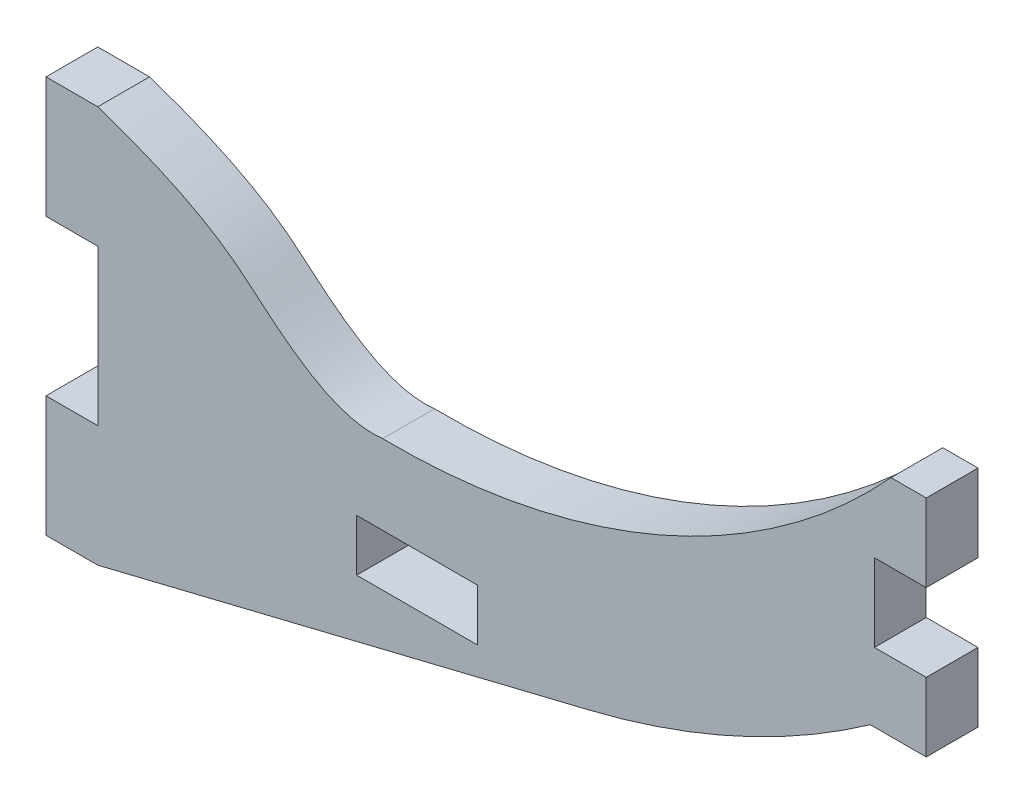
ISO-10303-21;
HEADER;
FILE_DESCRIPTION(('STEP AP214'),'2;1');
FILE_NAME('part.step','',(''),(''),'','','');
FILE_SCHEMA(('AUTOMOTIVE_DESIGN { 1 0 10303 214 1 1 1 1 }'));
ENDSEC;
DATA;
#1=APPLICATION_CONTEXT('core data for automotive mechanical design processes');
#2=APPLICATION_PROTOCOL_DEFINITION('international standard','automotive_design',2000,#1);
#3=PRODUCT_CONTEXT('',#1,'mechanical');
#4=PRODUCT('Part','Part','',(#3));
#5=PRODUCT_RELATED_PRODUCT_CATEGORY('part','',(#4));
#6=PRODUCT_DEFINITION_FORMATION('','',#4);
#7=PRODUCT_DEFINITION_CONTEXT('part definition',#1,'design');
#8=PRODUCT_DEFINITION('design','',#6,#7);
#9=PRODUCT_DEFINITION_SHAPE('','',#8);
#10=(LENGTH_UNIT() NAMED_UNIT(*) SI_UNIT(.MILLI.,.METRE.));
#11=(NAMED_UNIT(*) PLANE_ANGLE_UNIT() SI_UNIT($,.RADIAN.));
#12=(NAMED_UNIT(*) SI_UNIT($,.STERADIAN.) SOLID_ANGLE_UNIT());
#13=UNCERTAINTY_MEASURE_WITH_UNIT(LENGTH_MEASURE(1.E-05),#10,'distance_accuracy_value','');
#14=(GEOMETRIC_REPRESENTATION_CONTEXT(3) GLOBAL_UNCERTAINTY_ASSIGNED_CONTEXT((#13)) GLOBAL_UNIT_ASSIGNED_CONTEXT((#10,
#11,#12)) REPRESENTATION_CONTEXT('',''));
#15=CARTESIAN_POINT('',(0.,0.,0.));
#16=DIRECTION('',(0.,0.,1.));
#17=DIRECTION('',(1.,0.,0.));
#18=AXIS2_PLACEMENT_3D('',#15,#16,#17);
#19=CARTESIAN_POINT('',(17.093420495511,53.6001101518146,3.));
#20=DIRECTION('',(0.,0.,-1.));
#21=DIRECTION('',(-1.,0.,0.));
#22=AXIS2_PLACEMENT_3D('',#19,#20,#21);
#23=CYLINDRICAL_SURFACE('',#22,48.);
#24=DIRECTION('',(0.,0.,-1.));
#25=VECTOR('',#24,1.);
#26=CARTESIAN_POINT('',(44.7581584776296,14.3743243422132,3.));
#27=LINE('',#26,#25);
#28=CARTESIAN_POINT('',(44.7581584776296,14.3743243422132,3.));
#29=VERTEX_POINT('',#28);
#30=CARTESIAN_POINT('',(44.7581584776297,14.3743243422133,0.));
#31=VERTEX_POINT('',#30);
#32=EDGE_CURVE('E157',#29,#31,#27,.T.);
#33=ORIENTED_EDGE('',*,*,#32,.F.);
#34=CARTESIAN_POINT('',(17.093420495511,53.6001101518146,3.));
#35=DIRECTION('',(0.,0.,1.));
#36=DIRECTION('',(1.,0.,0.));
#37=AXIS2_PLACEMENT_3D('',#34,#35,#36);
#38=CIRCLE('',#37,48.);
#39=CARTESIAN_POINT('',(28.5042134637411,6.97614846003865,3.));
#40=VERTEX_POINT('',#39);
#41=EDGE_CURVE('E299',#40,#29,#38,.T.);
#42=ORIENTED_EDGE('',*,*,#41,.F.);
#43=DIRECTION('',(0.,0.,-1.));
#44=VECTOR('',#43,1.);
#45=CARTESIAN_POINT('',(28.5042134637411,6.97614846003865,3.));
#46=LINE('',#45,#44);
#47=CARTESIAN_POINT('',(28.5042134637411,6.97614846003865,0.));
#48=VERTEX_POINT('',#47);
#49=EDGE_CURVE('E417',#40,#48,#46,.T.);
#50=ORIENTED_EDGE('',*,*,#49,.T.);
#51=CARTESIAN_POINT('',(17.093420495511,53.6001101518146,0.));
#52=DIRECTION('',(0.,0.,1.));
#53=DIRECTION('',(1.,0.,0.));
#54=AXIS2_PLACEMENT_3D('',#51,#52,#53);
#55=CIRCLE('',#54,48.);
#56=EDGE_CURVE('E162',#48,#31,#55,.T.);
#57=ORIENTED_EDGE('',*,*,#56,.T.);
#58=EDGE_LOOP('',(#33,#42,#50,#57));
#59=FACE_BOUND('',#58,.T.);
#60=ADVANCED_FACE('F140',(#59),#23,.T.);
#61=CARTESIAN_POINT('',(0.,0.,0.));
#62=DIRECTION('',(0.,0.,1.));
#63=DIRECTION('',(1.,0.,0.));
#64=AXIS2_PLACEMENT_3D('',#61,#62,#63);
#65=PLANE('',#64);
#66=DIRECTION('',(0.,1.,0.));
#67=VECTOR('',#66,1.);
#68=CARTESIAN_POINT('',(44.9999999999998,0.,0.));
#69=LINE('',#68,#67);
#70=CARTESIAN_POINT('',(44.9999999999998,18.3743243422132,0.));
#71=VERTEX_POINT('',#70);
#72=CARTESIAN_POINT('',(44.9999999999998,22.8743243422132,0.));
#73=VERTEX_POINT('',#72);
#74=EDGE_CURVE('E434',#71,#73,#69,.T.);
#75=ORIENTED_EDGE('',*,*,#74,.F.);
#76=DIRECTION('',(-1.,0.,0.));
#77=VECTOR('',#76,1.);
#78=CARTESIAN_POINT('',(0.,18.3743243422132,0.));
#79=LINE('',#78,#77);
#80=CARTESIAN_POINT('',(47.9999999999998,18.3743243422132,0.));
#81=VERTEX_POINT('',#80);
#82=EDGE_CURVE('E431',#81,#71,#79,.T.);
#83=ORIENTED_EDGE('',*,*,#82,.F.);
#84=DIRECTION('',(0.,1.,0.));
#85=VECTOR('',#84,1.);
#86=CARTESIAN_POINT('',(47.9999999999998,0.,0.));
#87=LINE('',#86,#85);
#88=CARTESIAN_POINT('',(47.9999999999998,14.3743243422132,0.));
#89=VERTEX_POINT('',#88);
#90=EDGE_CURVE('E423',#89,#81,#87,.T.);
#91=ORIENTED_EDGE('',*,*,#90,.F.);
#92=DIRECTION('',(1.,0.,0.));
#93=VECTOR('',#92,1.);
#94=CARTESIAN_POINT('',(44.7581584776297,14.3743243422133,0.));
#95=LINE('',#94,#93);
#96=EDGE_CURVE('E308',#31,#89,#95,.T.);
#97=ORIENTED_EDGE('',*,*,#96,.F.);
#98=ORIENTED_EDGE('',*,*,#56,.F.);
#99=DIRECTION('',(-0.971332535245332,-0.237724853504792,0.));
#100=VECTOR('',#99,1.);
#101=CARTESIAN_POINT('',(0.,0.,0.));
#102=LINE('',#101,#100);
#103=CARTESIAN_POINT('',(0.,0.,0.));
#104=VERTEX_POINT('',#103);
#105=EDGE_CURVE('E415',#48,#104,#102,.T.);
#106=ORIENTED_EDGE('',*,*,#105,.T.);
#107=DIRECTION('',(-1.,0.,0.));
#108=VECTOR('',#107,1.);
#109=CARTESIAN_POINT('',(0.,0.,0.));
#110=LINE('',#109,#108);
#111=CARTESIAN_POINT('',(-3.,0.,0.));
#112=VERTEX_POINT('',#111);
#113=EDGE_CURVE('E488',#104,#112,#110,.T.);
#114=ORIENTED_EDGE('',*,*,#113,.T.);
#115=DIRECTION('',(0.,1.,0.));
#116=VECTOR('',#115,1.);
#117=CARTESIAN_POINT('',(-3.,0.,0.));
#118=LINE('',#117,#116);
#119=CARTESIAN_POINT('',(-3.,7.,0.));
#120=VERTEX_POINT('',#119);
#121=EDGE_CURVE('E497',#112,#120,#118,.T.);
#122=ORIENTED_EDGE('',*,*,#121,.T.);
#123=DIRECTION('',(-1.,0.,0.));
#124=VECTOR('',#123,1.);
#125=CARTESIAN_POINT('',(0.,7.,0.));
#126=LINE('',#125,#124);
#127=CARTESIAN_POINT('',(0.,7.,0.));
#128=VERTEX_POINT('',#127);
#129=EDGE_CURVE('E348',#128,#120,#126,.T.);
#130=ORIENTED_EDGE('',*,*,#129,.F.);
#131=DIRECTION('',(0.,-1.,0.));
#132=VECTOR('',#131,1.);
#133=CARTESIAN_POINT('',(0.,0.,0.));
#134=LINE('',#133,#132);
#135=CARTESIAN_POINT('',(0.,16.0034039268152,0.));
#136=VERTEX_POINT('',#135);
#137=EDGE_CURVE('E421',#136,#128,#134,.T.);
#138=ORIENTED_EDGE('',*,*,#137,.F.);
#139=DIRECTION('',(-1.,0.,0.));
#140=VECTOR('',#139,1.);
#141=CARTESIAN_POINT('',(0.,16.0034039268152,0.));
#142=LINE('',#141,#140);
#143=CARTESIAN_POINT('',(-3.,16.0034039268152,0.));
#144=VERTEX_POINT('',#143);
#145=EDGE_CURVE('E474',#136,#144,#142,.T.);
#146=ORIENTED_EDGE('',*,*,#145,.T.);
#147=DIRECTION('',(0.,-1.,0.));
#148=VECTOR('',#147,1.);
#149=CARTESIAN_POINT('',(-3.,23.0034039268152,0.));
#150=LINE('',#149,#148);
#151=CARTESIAN_POINT('',(-3.,23.0034039268152,0.));
#152=VERTEX_POINT('',#151);
#153=EDGE_CURVE('E477',#152,#144,#150,.T.);
#154=ORIENTED_EDGE('',*,*,#153,.F.);
#155=DIRECTION('',(-1.,0.,0.));
#156=VECTOR('',#155,1.);
#157=CARTESIAN_POINT('',(0.,23.0034039268152,0.));
#158=LINE('',#157,#156);
#159=CARTESIAN_POINT('',(0.,23.0034039268152,0.));
#160=VERTEX_POINT('',#159);
#161=EDGE_CURVE('E469',#160,#152,#158,.T.);
#162=ORIENTED_EDGE('',*,*,#161,.F.);
#163=CARTESIAN_POINT('',(0.,23.0034039268152,0.));
#164=CARTESIAN_POINT('',(3.76889523643891,21.7485211092511,0.));
#165=CARTESIAN_POINT('',(6.94738773169784,20.1030633599487,0.));
#166=CARTESIAN_POINT('',(11.1476301002185,16.4081642171854,0.));
#167=CARTESIAN_POINT('',(14.0280026405796,14.311208733812,0.));
#168=CARTESIAN_POINT('',(16.5087605178691,14.6044927992127,0.));
#169=B_SPLINE_CURVE_WITH_KNOTS('',3,(#163,#164,#165,#166,#167,#168),.UNSPECIFIED.,.F.,.F.,(4,1,
1,4),(0.,0.366175842946464,0.466175842946464,1.),.UNSPECIFIED.);
#170=CARTESIAN_POINT('',(16.5087605178691,14.6044927992128,0.));
#171=VERTEX_POINT('',#170);
#172=EDGE_CURVE('E426',#160,#171,#169,.T.);
#173=ORIENTED_EDGE('',*,*,#172,.T.);
#174=CARTESIAN_POINT('',(17.093420495511,53.6001101518146,0.));
#175=DIRECTION('',(0.,0.,1.));
#176=DIRECTION('',(1.,0.,0.));
#177=AXIS2_PLACEMENT_3D('',#174,#175,#176);
#178=CIRCLE('',#177,39.);
#179=CARTESIAN_POINT('',(45.9587657847833,27.3743243422133,0.));
#180=VERTEX_POINT('',#179);
#181=EDGE_CURVE('E356',#171,#180,#178,.T.);
#182=ORIENTED_EDGE('',*,*,#181,.T.);
#183=DIRECTION('',(-1.,0.,0.));
#184=VECTOR('',#183,1.);
#185=CARTESIAN_POINT('',(0.,27.3743243422133,0.));
#186=LINE('',#185,#184);
#187=CARTESIAN_POINT('',(47.9999999999998,27.3743243422132,0.));
#188=VERTEX_POINT('',#187);
#189=EDGE_CURVE('E440',#188,#180,#186,.T.);
#190=ORIENTED_EDGE('',*,*,#189,.F.);
#191=CARTESIAN_POINT('',(47.9999999999998,22.8743243422132,0.));
#192=VERTEX_POINT('',#191);
#193=EDGE_CURVE('E432',#192,#188,#87,.T.);
#194=ORIENTED_EDGE('',*,*,#193,.F.);
#195=DIRECTION('',(-1.,0.,0.));
#196=VECTOR('',#195,1.);
#197=CARTESIAN_POINT('',(0.,22.8743243422132,0.));
#198=LINE('',#197,#196);
#199=EDGE_CURVE('E437',#192,#73,#198,.T.);
#200=ORIENTED_EDGE('',*,*,#199,.T.);
#201=EDGE_LOOP('',(#75,#83,#91,#97,#98,#106,#114,#122,#130,#138,#146,#154,#162,#173,#182,#190,
#194,#200));
#202=FACE_BOUND('',#201,.T.);
#203=DIRECTION('',(0.,-1.,0.));
#204=VECTOR('',#203,1.);
#205=CARTESIAN_POINT('',(15.,10.,0.));
#206=LINE('',#205,#204);
#207=CARTESIAN_POINT('',(15.,10.,0.));
#208=VERTEX_POINT('',#207);
#209=CARTESIAN_POINT('',(15.,7.,0.));
#210=VERTEX_POINT('',#209);
#211=EDGE_CURVE('E314',#208,#210,#206,.T.);
#212=ORIENTED_EDGE('',*,*,#211,.T.);
#213=DIRECTION('',(1.,0.,0.));
#214=VECTOR('',#213,1.);
#215=CARTESIAN_POINT('',(15.,7.,0.));
#216=LINE('',#215,#214);
#217=CARTESIAN_POINT('',(22.,7.,0.));
#218=VERTEX_POINT('',#217);
#219=EDGE_CURVE('E331',#210,#218,#216,.T.);
#220=ORIENTED_EDGE('',*,*,#219,.T.);
#221=DIRECTION('',(0.,1.,0.));
#222=VECTOR('',#221,1.);
#223=CARTESIAN_POINT('',(22.,10.,0.));
#224=LINE('',#223,#222);
#225=CARTESIAN_POINT('',(22.,10.,0.));
#226=VERTEX_POINT('',#225);
#227=EDGE_CURVE('E334',#218,#226,#224,.T.);
#228=ORIENTED_EDGE('',*,*,#227,.T.);
#229=DIRECTION('',(-1.,0.,0.));
#230=VECTOR('',#229,1.);
#231=CARTESIAN_POINT('',(15.,10.,0.));
#232=LINE('',#231,#230);
#233=EDGE_CURVE('E321',#226,#208,#232,.T.);
#234=ORIENTED_EDGE('',*,*,#233,.T.);
#235=EDGE_LOOP('',(#212,#220,#228,#234));
#236=FACE_BOUND('',#235,.T.);
#237=ADVANCED_FACE('F396',(#202,#236),#65,.F.);
#238=CARTESIAN_POINT('',(0.,0.,3.));
#239=DIRECTION('',(0.,0.,1.));
#240=DIRECTION('',(1.,0.,0.));
#241=AXIS2_PLACEMENT_3D('',#238,#239,#240);
#242=PLANE('',#241);
#243=DIRECTION('',(-1.,0.,0.));
#244=VECTOR('',#243,1.);
#245=CARTESIAN_POINT('',(0.,18.3743243422132,3.));
#246=LINE('',#245,#244);
#247=CARTESIAN_POINT('',(47.9999999999998,18.3743243422132,3.));
#248=VERTEX_POINT('',#247);
#249=CARTESIAN_POINT('',(44.9999999999998,18.3743243422132,3.));
#250=VERTEX_POINT('',#249);
#251=EDGE_CURVE('E298',#248,#250,#246,.T.);
#252=ORIENTED_EDGE('',*,*,#251,.T.);
#253=DIRECTION('',(0.,1.,0.));
#254=VECTOR('',#253,1.);
#255=CARTESIAN_POINT('',(44.9999999999998,0.,3.));
#256=LINE('',#255,#254);
#257=CARTESIAN_POINT('',(44.9999999999998,22.8743243422132,3.));
#258=VERTEX_POINT('',#257);
#259=EDGE_CURVE('E514',#250,#258,#256,.T.);
#260=ORIENTED_EDGE('',*,*,#259,.T.);
#261=DIRECTION('',(-1.,0.,0.));
#262=VECTOR('',#261,1.);
#263=CARTESIAN_POINT('',(0.,22.8743243422132,3.));
#264=LINE('',#263,#262);
#265=CARTESIAN_POINT('',(47.9999999999998,22.8743243422132,3.));
#266=VERTEX_POINT('',#265);
#267=EDGE_CURVE('E516',#266,#258,#264,.T.);
#268=ORIENTED_EDGE('',*,*,#267,.F.);
#269=DIRECTION('',(0.,1.,0.));
#270=VECTOR('',#269,1.);
#271=CARTESIAN_POINT('',(47.9999999999998,0.,3.));
#272=LINE('',#271,#270);
#273=CARTESIAN_POINT('',(47.9999999999998,27.3743243422132,3.));
#274=VERTEX_POINT('',#273);
#275=EDGE_CURVE('E301',#266,#274,#272,.T.);
#276=ORIENTED_EDGE('',*,*,#275,.T.);
#277=DIRECTION('',(-1.,0.,0.));
#278=VECTOR('',#277,1.);
#279=CARTESIAN_POINT('',(0.,27.3743243422133,3.));
#280=LINE('',#279,#278);
#281=CARTESIAN_POINT('',(45.9587657847833,27.3743243422133,3.));
#282=VERTEX_POINT('',#281);
#283=EDGE_CURVE('E519',#274,#282,#280,.T.);
#284=ORIENTED_EDGE('',*,*,#283,.T.);
#285=CARTESIAN_POINT('',(17.093420495511,53.6001101518146,3.));
#286=DIRECTION('',(0.,0.,1.));
#287=DIRECTION('',(1.,0.,0.));
#288=AXIS2_PLACEMENT_3D('',#285,#286,#287);
#289=CIRCLE('',#288,39.);
#290=CARTESIAN_POINT('',(16.5087605178691,14.6044927992128,3.));
#291=VERTEX_POINT('',#290);
#292=EDGE_CURVE('E448',#291,#282,#289,.T.);
#293=ORIENTED_EDGE('',*,*,#292,.F.);
#294=CARTESIAN_POINT('',(0.,23.0034039268152,3.));
#295=CARTESIAN_POINT('',(3.76889523643891,21.7485211092511,3.));
#296=CARTESIAN_POINT('',(6.94738773169784,20.1030633599487,3.));
#297=CARTESIAN_POINT('',(11.1476301002185,16.4081642171854,3.));
#298=CARTESIAN_POINT('',(14.0280026405796,14.311208733812,3.));
#299=CARTESIAN_POINT('',(16.5087605178691,14.6044927992127,3.));
#300=B_SPLINE_CURVE_WITH_KNOTS('',3,(#294,#295,#296,#297,#298,#299),.UNSPECIFIED.,.F.,.F.,(4,1,
1,4),(0.,0.366175842946464,0.466175842946464,1.),.UNSPECIFIED.);
#301=CARTESIAN_POINT('',(0.,23.0034039268152,3.));
#302=VERTEX_POINT('',#301);
#303=EDGE_CURVE('E349',#302,#291,#300,.T.);
#304=ORIENTED_EDGE('',*,*,#303,.F.);
#305=DIRECTION('',(-1.,0.,0.));
#306=VECTOR('',#305,1.);
#307=CARTESIAN_POINT('',(0.,23.0034039268152,3.));
#308=LINE('',#307,#306);
#309=CARTESIAN_POINT('',(-3.,23.0034039268152,3.));
#310=VERTEX_POINT('',#309);
#311=EDGE_CURVE('E471',#302,#310,#308,.T.);
#312=ORIENTED_EDGE('',*,*,#311,.T.);
#313=DIRECTION('',(0.,-1.,0.));
#314=VECTOR('',#313,1.);
#315=CARTESIAN_POINT('',(-3.,23.0034039268152,3.));
#316=LINE('',#315,#314);
#317=CARTESIAN_POINT('',(-3.,16.0034039268152,3.));
#318=VERTEX_POINT('',#317);
#319=EDGE_CURVE('E468',#310,#318,#316,.T.);
#320=ORIENTED_EDGE('',*,*,#319,.T.);
#321=DIRECTION('',(-1.,0.,0.));
#322=VECTOR('',#321,1.);
#323=CARTESIAN_POINT('',(0.,16.0034039268152,3.));
#324=LINE('',#323,#322);
#325=CARTESIAN_POINT('',(0.,16.0034039268152,3.));
#326=VERTEX_POINT('',#325);
#327=EDGE_CURVE('E465',#326,#318,#324,.T.);
#328=ORIENTED_EDGE('',*,*,#327,.F.);
#329=DIRECTION('',(0.,-1.,0.));
#330=VECTOR('',#329,1.);
#331=CARTESIAN_POINT('',(0.,0.,3.));
#332=LINE('',#331,#330);
#333=CARTESIAN_POINT('',(0.,7.,3.));
#334=VERTEX_POINT('',#333);
#335=EDGE_CURVE('E355',#326,#334,#332,.T.);
#336=ORIENTED_EDGE('',*,*,#335,.T.);
#337=DIRECTION('',(-1.,0.,0.));
#338=VECTOR('',#337,1.);
#339=CARTESIAN_POINT('',(0.,7.,3.));
#340=LINE('',#339,#338);
#341=CARTESIAN_POINT('',(-3.,7.,3.));
#342=VERTEX_POINT('',#341);
#343=EDGE_CURVE('E485',#334,#342,#340,.T.);
#344=ORIENTED_EDGE('',*,*,#343,.T.);
#345=DIRECTION('',(0.,1.,0.));
#346=VECTOR('',#345,1.);
#347=CARTESIAN_POINT('',(-3.,0.,3.));
#348=LINE('',#347,#346);
#349=CARTESIAN_POINT('',(-3.,0.,3.));
#350=VERTEX_POINT('',#349);
#351=EDGE_CURVE('E487',#350,#342,#348,.T.);
#352=ORIENTED_EDGE('',*,*,#351,.F.);
#353=DIRECTION('',(-1.,0.,0.));
#354=VECTOR('',#353,1.);
#355=CARTESIAN_POINT('',(0.,0.,3.));
#356=LINE('',#355,#354);
#357=CARTESIAN_POINT('',(0.,0.,3.));
#358=VERTEX_POINT('',#357);
#359=EDGE_CURVE('E491',#358,#350,#356,.T.);
#360=ORIENTED_EDGE('',*,*,#359,.F.);
#361=DIRECTION('',(-0.971332535245332,-0.237724853504792,0.));
#362=VECTOR('',#361,1.);
#363=CARTESIAN_POINT('',(0.,0.,3.));
#364=LINE('',#363,#362);
#365=EDGE_CURVE('E509',#40,#358,#364,.T.);
#366=ORIENTED_EDGE('',*,*,#365,.F.);
#367=ORIENTED_EDGE('',*,*,#41,.T.);
#368=DIRECTION('',(1.,0.,0.));
#369=VECTOR('',#368,1.);
#370=CARTESIAN_POINT('',(44.7581584776297,14.3743243422133,3.));
#371=LINE('',#370,#369);
#372=CARTESIAN_POINT('',(47.9999999999998,14.3743243422132,3.));
#373=VERTEX_POINT('',#372);
#374=EDGE_CURVE('E303',#29,#373,#371,.T.);
#375=ORIENTED_EDGE('',*,*,#374,.T.);
#376=EDGE_CURVE('E289',#373,#248,#272,.T.);
#377=ORIENTED_EDGE('',*,*,#376,.T.);
#378=EDGE_LOOP('',(#252,#260,#268,#276,#284,#293,#304,#312,#320,#328,#336,#344,#352,#360,#366,
#367,#375,#377));
#379=FACE_BOUND('',#378,.T.);
#380=DIRECTION('',(1.,0.,0.));
#381=VECTOR('',#380,1.);
#382=CARTESIAN_POINT('',(15.,7.,3.));
#383=LINE('',#382,#381);
#384=CARTESIAN_POINT('',(15.,7.,3.));
#385=VERTEX_POINT('',#384);
#386=CARTESIAN_POINT('',(22.,7.,3.));
#387=VERTEX_POINT('',#386);
#388=EDGE_CURVE('E320',#385,#387,#383,.T.);
#389=ORIENTED_EDGE('',*,*,#388,.F.);
#390=DIRECTION('',(0.,-1.,0.));
#391=VECTOR('',#390,1.);
#392=CARTESIAN_POINT('',(15.,10.,3.));
#393=LINE('',#392,#391);
#394=CARTESIAN_POINT('',(15.,10.,3.));
#395=VERTEX_POINT('',#394);
#396=EDGE_CURVE('E318',#395,#385,#393,.T.);
#397=ORIENTED_EDGE('',*,*,#396,.F.);
#398=DIRECTION('',(-1.,0.,0.));
#399=VECTOR('',#398,1.);
#400=CARTESIAN_POINT('',(15.,10.,3.));
#401=LINE('',#400,#399);
#402=CARTESIAN_POINT('',(22.,10.,3.));
#403=VERTEX_POINT('',#402);
#404=EDGE_CURVE('E326',#403,#395,#401,.T.);
#405=ORIENTED_EDGE('',*,*,#404,.F.);
#406=DIRECTION('',(0.,1.,0.));
#407=VECTOR('',#406,1.);
#408=CARTESIAN_POINT('',(22.,10.,3.));
#409=LINE('',#408,#407);
#410=EDGE_CURVE('E323',#387,#403,#409,.T.);
#411=ORIENTED_EDGE('',*,*,#410,.F.);
#412=EDGE_LOOP('',(#389,#397,#405,#411));
#413=FACE_BOUND('',#412,.T.);
#414=ADVANCED_FACE('F304',(#379,#413),#242,.T.);
#415=CARTESIAN_POINT('',(17.093420495511,53.6001101518146,3.));
#416=DIRECTION('',(0.,0.,-1.));
#417=DIRECTION('',(-1.,0.,0.));
#418=AXIS2_PLACEMENT_3D('',#415,#416,#417);
#419=CYLINDRICAL_SURFACE('',#418,39.);
#420=ORIENTED_EDGE('',*,*,#181,.F.);
#421=DIRECTION('',(0.,0.,-1.));
#422=VECTOR('',#421,1.);
#423=CARTESIAN_POINT('',(16.5087605178691,14.6044927992128,3.));
#424=LINE('',#423,#422);
#425=EDGE_CURVE('E445',#291,#171,#424,.T.);
#426=ORIENTED_EDGE('',*,*,#425,.F.);
#427=ORIENTED_EDGE('',*,*,#292,.T.);
#428=DIRECTION('',(0.,0.,-1.));
#429=VECTOR('',#428,1.);
#430=CARTESIAN_POINT('',(45.9587657847833,27.3743243422133,3.));
#431=LINE('',#430,#429);
#432=EDGE_CURVE('E447',#282,#180,#431,.T.);
#433=ORIENTED_EDGE('',*,*,#432,.T.);
#434=EDGE_LOOP('',(#420,#426,#427,#433));
#435=FACE_BOUND('',#434,.T.);
#436=ADVANCED_FACE('F387',(#435),#419,.F.);
#437=CARTESIAN_POINT('',(0.,27.3743243422133,3.));
#438=DIRECTION('',(0.,-1.,0.));
#439=DIRECTION('',(1.,0.,0.));
#440=AXIS2_PLACEMENT_3D('',#437,#438,#439);
#441=PLANE('',#440);
#442=ORIENTED_EDGE('',*,*,#189,.T.);
#443=ORIENTED_EDGE('',*,*,#432,.F.);
#444=ORIENTED_EDGE('',*,*,#283,.F.);
#445=DIRECTION('',(0.,0.,-1.));
#446=VECTOR('',#445,1.);
#447=CARTESIAN_POINT('',(47.9999999999998,27.3743243422132,3.));
#448=LINE('',#447,#446);
#449=EDGE_CURVE('E450',#274,#188,#448,.T.);
#450=ORIENTED_EDGE('',*,*,#449,.T.);
#451=EDGE_LOOP('',(#442,#443,#444,#450));
#452=FACE_BOUND('',#451,.T.);
#453=ADVANCED_FACE('F538',(#452),#441,.F.);
#454=CARTESIAN_POINT('',(47.9999999999998,0.,3.));
#455=DIRECTION('',(-1.,0.,0.));
#456=DIRECTION('',(0.,0.,1.));
#457=AXIS2_PLACEMENT_3D('',#454,#455,#456);
#458=PLANE('',#457);
#459=ORIENTED_EDGE('',*,*,#193,.T.);
#460=ORIENTED_EDGE('',*,*,#449,.F.);
#461=ORIENTED_EDGE('',*,*,#275,.F.);
#462=DIRECTION('',(0.,0.,-1.));
#463=VECTOR('',#462,1.);
#464=CARTESIAN_POINT('',(47.9999999999998,22.8743243422132,3.));
#465=LINE('',#464,#463);
#466=EDGE_CURVE('E453',#266,#192,#465,.T.);
#467=ORIENTED_EDGE('',*,*,#466,.T.);
#468=EDGE_LOOP('',(#459,#460,#461,#467));
#469=FACE_BOUND('',#468,.T.);
#470=ADVANCED_FACE('F412',(#469),#458,.F.);
#471=CARTESIAN_POINT('',(0.,22.8743243422132,3.));
#472=DIRECTION('',(0.,-1.,0.));
#473=DIRECTION('',(0.,0.,-1.));
#474=AXIS2_PLACEMENT_3D('',#471,#472,#473);
#475=PLANE('',#474);
#476=ORIENTED_EDGE('',*,*,#199,.F.);
#477=ORIENTED_EDGE('',*,*,#466,.F.);
#478=ORIENTED_EDGE('',*,*,#267,.T.);
#479=DIRECTION('',(0.,0.,-1.));
#480=VECTOR('',#479,1.);
#481=CARTESIAN_POINT('',(44.9999999999998,22.8743243422132,3.));
#482=LINE('',#481,#480);
#483=EDGE_CURVE('E455',#258,#73,#482,.T.);
#484=ORIENTED_EDGE('',*,*,#483,.T.);
#485=EDGE_LOOP('',(#476,#477,#478,#484));
#486=FACE_BOUND('',#485,.T.);
#487=ADVANCED_FACE('F544',(#486),#475,.T.);
#488=CARTESIAN_POINT('',(44.9999999999998,0.,3.));
#489=DIRECTION('',(-1.,0.,0.));
#490=DIRECTION('',(0.,0.,1.));
#491=AXIS2_PLACEMENT_3D('',#488,#489,#490);
#492=PLANE('',#491);
#493=ORIENTED_EDGE('',*,*,#74,.T.);
#494=ORIENTED_EDGE('',*,*,#483,.F.);
#495=ORIENTED_EDGE('',*,*,#259,.F.);
#496=DIRECTION('',(0.,0.,-1.));
#497=VECTOR('',#496,1.);
#498=CARTESIAN_POINT('',(44.9999999999998,18.3743243422132,3.));
#499=LINE('',#498,#497);
#500=EDGE_CURVE('E457',#250,#71,#499,.T.);
#501=ORIENTED_EDGE('',*,*,#500,.T.);
#502=EDGE_LOOP('',(#493,#494,#495,#501));
#503=FACE_BOUND('',#502,.T.);
#504=ADVANCED_FACE('F550',(#503),#492,.F.);
#505=CARTESIAN_POINT('',(0.,18.3743243422132,3.));
#506=DIRECTION('',(0.,-1.,0.));
#507=DIRECTION('',(0.,0.,-1.));
#508=AXIS2_PLACEMENT_3D('',#505,#506,#507);
#509=PLANE('',#508);
#510=ORIENTED_EDGE('',*,*,#82,.T.);
#511=ORIENTED_EDGE('',*,*,#500,.F.);
#512=ORIENTED_EDGE('',*,*,#251,.F.);
#513=DIRECTION('',(0.,0.,-1.));
#514=VECTOR('',#513,1.);
#515=CARTESIAN_POINT('',(47.9999999999998,18.3743243422132,3.));
#516=LINE('',#515,#514);
#517=EDGE_CURVE('E295',#248,#81,#516,.T.);
#518=ORIENTED_EDGE('',*,*,#517,.T.);
#519=EDGE_LOOP('',(#510,#511,#512,#518));
#520=FACE_BOUND('',#519,.T.);
#521=ADVANCED_FACE('F404',(#520),#509,.F.);
#522=ORIENTED_EDGE('',*,*,#90,.T.);
#523=ORIENTED_EDGE('',*,*,#517,.F.);
#524=ORIENTED_EDGE('',*,*,#376,.F.);
#525=DIRECTION('',(0.,0.,-1.));
#526=VECTOR('',#525,1.);
#527=CARTESIAN_POINT('',(47.9999999999998,14.3743243422132,3.));
#528=LINE('',#527,#526);
#529=EDGE_CURVE('E293',#373,#89,#528,.T.);
#530=ORIENTED_EDGE('',*,*,#529,.T.);
#531=EDGE_LOOP('',(#522,#523,#524,#530));
#532=FACE_BOUND('',#531,.T.);
#533=ADVANCED_FACE('F291',(#532),#458,.F.);
#534=CARTESIAN_POINT('',(0.,0.,3.));
#535=DIRECTION('',(0.237724853504792,-0.971332535245332,0.));
#536=DIRECTION('',(0.971332535245332,0.237724853504792,0.));
#537=AXIS2_PLACEMENT_3D('',#534,#535,#536);
#538=PLANE('',#537);
#539=ORIENTED_EDGE('',*,*,#105,.F.);
#540=ORIENTED_EDGE('',*,*,#49,.F.);
#541=ORIENTED_EDGE('',*,*,#365,.T.);
#542=DIRECTION('',(0.,0.,-1.));
#543=VECTOR('',#542,1.);
#544=CARTESIAN_POINT('',(0.,0.,3.));
#545=LINE('',#544,#543);
#546=EDGE_CURVE('E418',#358,#104,#545,.T.);
#547=ORIENTED_EDGE('',*,*,#546,.T.);
#548=EDGE_LOOP('',(#539,#540,#541,#547));
#549=FACE_BOUND('',#548,.T.);
#550=ADVANCED_FACE('F367',(#549),#538,.T.);
#551=DIRECTION('',(0.,0.,-1.));
#552=VECTOR('',#551,1.);
#553=SURFACE_OF_LINEAR_EXTRUSION('',#300,#552);
#554=ORIENTED_EDGE('',*,*,#172,.F.);
#555=DIRECTION('',(0.,0.,-1.));
#556=VECTOR('',#555,1.);
#557=CARTESIAN_POINT('',(0.,23.0034039268152,3.));
#558=LINE('',#557,#556);
#559=EDGE_CURVE('E463',#302,#160,#558,.T.);
#560=ORIENTED_EDGE('',*,*,#559,.F.);
#561=ORIENTED_EDGE('',*,*,#303,.T.);
#562=ORIENTED_EDGE('',*,*,#425,.T.);
#563=EDGE_LOOP('',(#554,#560,#561,#562));
#564=FACE_BOUND('',#563,.T.);
#565=ADVANCED_FACE('F362',(#564),#553,.T.);
#566=CARTESIAN_POINT('',(0.,0.,3.));
#567=DIRECTION('',(1.,0.,0.));
#568=DIRECTION('',(0.,1.,0.));
#569=AXIS2_PLACEMENT_3D('',#566,#567,#568);
#570=PLANE('',#569);
#571=ORIENTED_EDGE('',*,*,#335,.F.);
#572=DIRECTION('',(0.,0.,-1.));
#573=VECTOR('',#572,1.);
#574=CARTESIAN_POINT('',(0.,16.0034039268152,3.));
#575=LINE('',#574,#573);
#576=EDGE_CURVE('E12',#326,#136,#575,.T.);
#577=ORIENTED_EDGE('',*,*,#576,.T.);
#578=ORIENTED_EDGE('',*,*,#137,.T.);
#579=DIRECTION('',(0.,0.,-1.));
#580=VECTOR('',#579,1.);
#581=CARTESIAN_POINT('',(0.,7.,3.));
#582=LINE('',#581,#580);
#583=EDGE_CURVE('E149',#334,#128,#582,.T.);
#584=ORIENTED_EDGE('',*,*,#583,.F.);
#585=EDGE_LOOP('',(#571,#577,#578,#584));
#586=FACE_BOUND('',#585,.T.);
#587=ADVANCED_FACE('F366',(#586),#570,.F.);
#588=CARTESIAN_POINT('',(0.,0.,3.));
#589=DIRECTION('',(0.,-1.,0.));
#590=DIRECTION('',(1.,0.,0.));
#591=AXIS2_PLACEMENT_3D('',#588,#589,#590);
#592=PLANE('',#591);
#593=ORIENTED_EDGE('',*,*,#113,.F.);
#594=ORIENTED_EDGE('',*,*,#546,.F.);
#595=ORIENTED_EDGE('',*,*,#359,.T.);
#596=DIRECTION('',(0.,0.,-1.));
#597=VECTOR('',#596,1.);
#598=CARTESIAN_POINT('',(-3.,0.,3.));
#599=LINE('',#598,#597);
#600=EDGE_CURVE('E494',#350,#112,#599,.T.);
#601=ORIENTED_EDGE('',*,*,#600,.T.);
#602=EDGE_LOOP('',(#593,#594,#595,#601));
#603=FACE_BOUND('',#602,.T.);
#604=ADVANCED_FACE('F383',(#603),#592,.T.);
#605=CARTESIAN_POINT('',(-3.,0.,3.));
#606=DIRECTION('',(-1.,0.,0.));
#607=DIRECTION('',(0.,-1.,0.));
#608=AXIS2_PLACEMENT_3D('',#605,#606,#607);
#609=PLANE('',#608);
#610=ORIENTED_EDGE('',*,*,#121,.F.);
#611=ORIENTED_EDGE('',*,*,#600,.F.);
#612=ORIENTED_EDGE('',*,*,#351,.T.);
#613=DIRECTION('',(0.,0.,-1.));
#614=VECTOR('',#613,1.);
#615=CARTESIAN_POINT('',(-3.,7.,3.));
#616=LINE('',#615,#614);
#617=EDGE_CURVE('E144',#342,#120,#616,.T.);
#618=ORIENTED_EDGE('',*,*,#617,.T.);
#619=EDGE_LOOP('',(#610,#611,#612,#618));
#620=FACE_BOUND('',#619,.T.);
#621=ADVANCED_FACE('F385',(#620),#609,.T.);
#622=CARTESIAN_POINT('',(0.,7.,3.));
#623=DIRECTION('',(0.,-1.,0.));
#624=DIRECTION('',(1.,0.,0.));
#625=AXIS2_PLACEMENT_3D('',#622,#623,#624);
#626=PLANE('',#625);
#627=ORIENTED_EDGE('',*,*,#129,.T.);
#628=ORIENTED_EDGE('',*,*,#617,.F.);
#629=ORIENTED_EDGE('',*,*,#343,.F.);
#630=ORIENTED_EDGE('',*,*,#583,.T.);
#631=EDGE_LOOP('',(#627,#628,#629,#630));
#632=FACE_BOUND('',#631,.T.);
#633=ADVANCED_FACE('F142',(#632),#626,.F.);
#634=CARTESIAN_POINT('',(-3.,23.0034039268152,3.));
#635=DIRECTION('',(1.,0.,0.));
#636=DIRECTION('',(0.,1.,0.));
#637=AXIS2_PLACEMENT_3D('',#634,#635,#636);
#638=PLANE('',#637);
#639=ORIENTED_EDGE('',*,*,#153,.T.);
#640=DIRECTION('',(0.,0.,-1.));
#641=VECTOR('',#640,1.);
#642=CARTESIAN_POINT('',(-3.,16.0034039268152,3.));
#643=LINE('',#642,#641);
#644=EDGE_CURVE('E473',#318,#144,#643,.T.);
#645=ORIENTED_EDGE('',*,*,#644,.F.);
#646=ORIENTED_EDGE('',*,*,#319,.F.);
#647=DIRECTION('',(0.,0.,-1.));
#648=VECTOR('',#647,1.);
#649=CARTESIAN_POINT('',(-3.,23.0034039268152,3.));
#650=LINE('',#649,#648);
#651=EDGE_CURVE('E481',#310,#152,#650,.T.);
#652=ORIENTED_EDGE('',*,*,#651,.T.);
#653=EDGE_LOOP('',(#639,#645,#646,#652));
#654=FACE_BOUND('',#653,.T.);
#655=ADVANCED_FACE('F376',(#654),#638,.F.);
#656=CARTESIAN_POINT('',(0.,16.0034039268152,3.));
#657=DIRECTION('',(0.,-1.,0.));
#658=DIRECTION('',(0.,0.,-1.));
#659=AXIS2_PLACEMENT_3D('',#656,#657,#658);
#660=PLANE('',#659);
#661=ORIENTED_EDGE('',*,*,#145,.F.);
#662=ORIENTED_EDGE('',*,*,#576,.F.);
#663=ORIENTED_EDGE('',*,*,#327,.T.);
#664=ORIENTED_EDGE('',*,*,#644,.T.);
#665=EDGE_LOOP('',(#661,#662,#663,#664));
#666=FACE_BOUND('',#665,.T.);
#667=ADVANCED_FACE('F374',(#666),#660,.T.);
#668=CARTESIAN_POINT('',(0.,23.0034039268152,3.));
#669=DIRECTION('',(0.,-1.,0.));
#670=DIRECTION('',(0.,0.,-1.));
#671=AXIS2_PLACEMENT_3D('',#668,#669,#670);
#672=PLANE('',#671);
#673=ORIENTED_EDGE('',*,*,#161,.T.);
#674=ORIENTED_EDGE('',*,*,#651,.F.);
#675=ORIENTED_EDGE('',*,*,#311,.F.);
#676=ORIENTED_EDGE('',*,*,#559,.T.);
#677=EDGE_LOOP('',(#673,#674,#675,#676));
#678=FACE_BOUND('',#677,.T.);
#679=ADVANCED_FACE('F370',(#678),#672,.F.);
#680=CARTESIAN_POINT('',(15.,10.,3.));
#681=DIRECTION('',(1.,0.,0.));
#682=DIRECTION('',(0.,0.,-1.));
#683=AXIS2_PLACEMENT_3D('',#680,#681,#682);
#684=PLANE('',#683);
#685=ORIENTED_EDGE('',*,*,#211,.F.);
#686=DIRECTION('',(0.,0.,-1.));
#687=VECTOR('',#686,1.);
#688=CARTESIAN_POINT('',(15.,10.,3.));
#689=LINE('',#688,#687);
#690=EDGE_CURVE('E328',#395,#208,#689,.T.);
#691=ORIENTED_EDGE('',*,*,#690,.F.);
#692=ORIENTED_EDGE('',*,*,#396,.T.);
#693=DIRECTION('',(0.,0.,-1.));
#694=VECTOR('',#693,1.);
#695=CARTESIAN_POINT('',(15.,7.,3.));
#696=LINE('',#695,#694);
#697=EDGE_CURVE('E345',#385,#210,#696,.T.);
#698=ORIENTED_EDGE('',*,*,#697,.T.);
#699=EDGE_LOOP('',(#685,#691,#692,#698));
#700=FACE_BOUND('',#699,.T.);
#701=ADVANCED_FACE('F373',(#700),#684,.T.);
#702=CARTESIAN_POINT('',(15.,7.,3.));
#703=DIRECTION('',(0.,1.,0.));
#704=DIRECTION('',(0.,0.,1.));
#705=AXIS2_PLACEMENT_3D('',#702,#703,#704);
#706=PLANE('',#705);
#707=ORIENTED_EDGE('',*,*,#219,.F.);
#708=ORIENTED_EDGE('',*,*,#697,.F.);
#709=ORIENTED_EDGE('',*,*,#388,.T.);
#710=DIRECTION('',(0.,0.,-1.));
#711=VECTOR('',#710,1.);
#712=CARTESIAN_POINT('',(22.,7.,3.));
#713=LINE('',#712,#711);
#714=EDGE_CURVE('E343',#387,#218,#713,.T.);
#715=ORIENTED_EDGE('',*,*,#714,.T.);
#716=EDGE_LOOP('',(#707,#708,#709,#715));
#717=FACE_BOUND('',#716,.T.);
#718=ADVANCED_FACE('F603',(#717),#706,.T.);
#719=CARTESIAN_POINT('',(22.,10.,3.));
#720=DIRECTION('',(-1.,0.,0.));
#721=DIRECTION('',(0.,0.,1.));
#722=AXIS2_PLACEMENT_3D('',#719,#720,#721);
#723=PLANE('',#722);
#724=ORIENTED_EDGE('',*,*,#227,.F.);
#725=ORIENTED_EDGE('',*,*,#714,.F.);
#726=ORIENTED_EDGE('',*,*,#410,.T.);
#727=DIRECTION('',(0.,0.,-1.));
#728=VECTOR('',#727,1.);
#729=CARTESIAN_POINT('',(22.,10.,3.));
#730=LINE('',#729,#728);
#731=EDGE_CURVE('E341',#403,#226,#730,.T.);
#732=ORIENTED_EDGE('',*,*,#731,.T.);
#733=EDGE_LOOP('',(#724,#725,#726,#732));
#734=FACE_BOUND('',#733,.T.);
#735=ADVANCED_FACE('F595',(#734),#723,.T.);
#736=CARTESIAN_POINT('',(15.,10.,3.));
#737=DIRECTION('',(0.,-1.,0.));
#738=DIRECTION('',(0.,0.,-1.));
#739=AXIS2_PLACEMENT_3D('',#736,#737,#738);
#740=PLANE('',#739);
#741=ORIENTED_EDGE('',*,*,#233,.F.);
#742=ORIENTED_EDGE('',*,*,#731,.F.);
#743=ORIENTED_EDGE('',*,*,#404,.T.);
#744=ORIENTED_EDGE('',*,*,#690,.T.);
#745=EDGE_LOOP('',(#741,#742,#743,#744));
#746=FACE_BOUND('',#745,.T.);
#747=ADVANCED_FACE('F586',(#746),#740,.T.);
#748=CARTESIAN_POINT('',(44.7581584776297,14.3743243422133,3.));
#749=DIRECTION('',(0.,1.,0.));
#750=DIRECTION('',(-1.,0.,0.));
#751=AXIS2_PLACEMENT_3D('',#748,#749,#750);
#752=PLANE('',#751);
#753=ORIENTED_EDGE('',*,*,#96,.T.);
#754=ORIENTED_EDGE('',*,*,#529,.F.);
#755=ORIENTED_EDGE('',*,*,#374,.F.);
#756=ORIENTED_EDGE('',*,*,#32,.T.);
#757=EDGE_LOOP('',(#753,#754,#755,#756));
#758=FACE_BOUND('',#757,.T.);
#759=ADVANCED_FACE('F311',(#758),#752,.F.);
#760=CLOSED_SHELL('',(#60,#237,#414,#436,#453,#470,#487,#504,#521,#533,#550,#565,#587,#604,#621,
#633,#655,#667,#679,#701,#718,#735,#747,#759));
#761=MANIFOLD_SOLID_BREP('B2',#760);
#762=ADVANCED_BREP_SHAPE_REPRESENTATION('',(#18,#761),#14);
#763=SHAPE_DEFINITION_REPRESENTATION(#9,#762);
ENDSEC;
END-ISO-10303-21;
